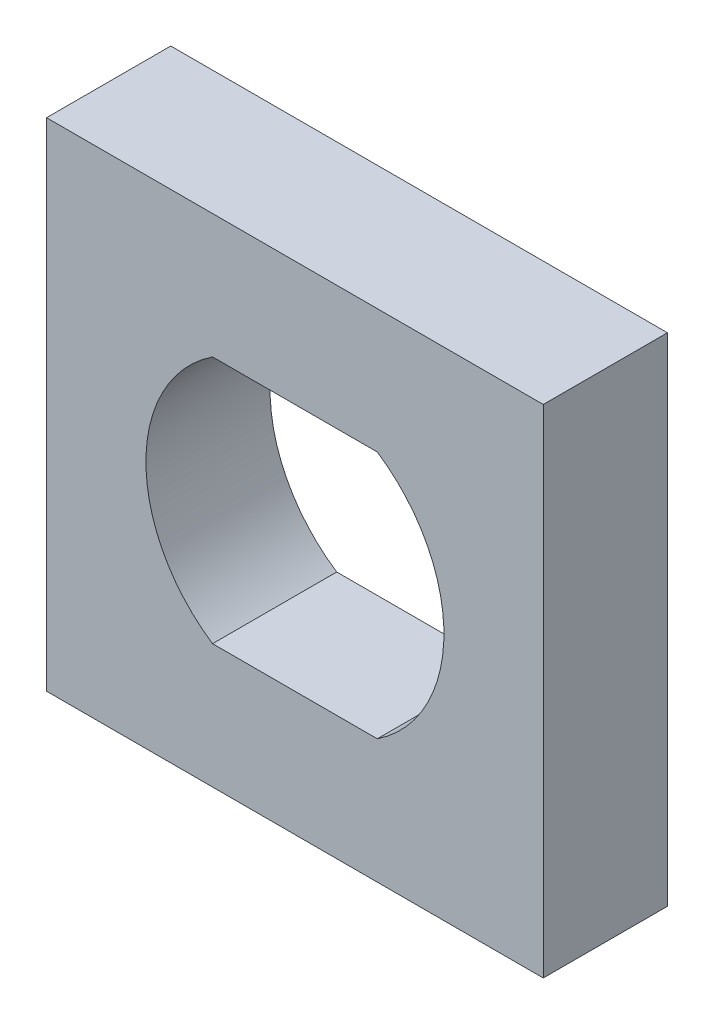
ISO-10303-21;
HEADER;
FILE_DESCRIPTION(('STEP AP214'),'2;1');
FILE_NAME('part.step','',(''),(''),'','','');
FILE_SCHEMA(('AUTOMOTIVE_DESIGN { 1 0 10303 214 1 1 1 1 }'));
ENDSEC;
DATA;
#1=APPLICATION_CONTEXT('core data for automotive mechanical design processes');
#2=APPLICATION_PROTOCOL_DEFINITION('international standard','automotive_design',2000,#1);
#3=PRODUCT_CONTEXT('',#1,'mechanical');
#4=PRODUCT('Part','Part','',(#3));
#5=PRODUCT_RELATED_PRODUCT_CATEGORY('part','',(#4));
#6=PRODUCT_DEFINITION_FORMATION('','',#4);
#7=PRODUCT_DEFINITION_CONTEXT('part definition',#1,'design');
#8=PRODUCT_DEFINITION('design','',#6,#7);
#9=PRODUCT_DEFINITION_SHAPE('','',#8);
#10=(LENGTH_UNIT() NAMED_UNIT(*) SI_UNIT(.MILLI.,.METRE.));
#11=(NAMED_UNIT(*) PLANE_ANGLE_UNIT() SI_UNIT($,.RADIAN.));
#12=(NAMED_UNIT(*) SI_UNIT($,.STERADIAN.) SOLID_ANGLE_UNIT());
#13=UNCERTAINTY_MEASURE_WITH_UNIT(LENGTH_MEASURE(1.E-05),#10,'distance_accuracy_value','');
#14=(GEOMETRIC_REPRESENTATION_CONTEXT(3) GLOBAL_UNCERTAINTY_ASSIGNED_CONTEXT((#13)) GLOBAL_UNIT_ASSIGNED_CONTEXT((#10,
#11,#12)) REPRESENTATION_CONTEXT('',''));
#15=CARTESIAN_POINT('',(0.,0.,0.));
#16=DIRECTION('',(0.,0.,1.));
#17=DIRECTION('',(1.,0.,0.));
#18=AXIS2_PLACEMENT_3D('',#15,#16,#17);
#19=CARTESIAN_POINT('',(10.,0.,5.));
#20=DIRECTION('',(1.,0.,0.));
#21=DIRECTION('',(0.,1.,0.));
#22=AXIS2_PLACEMENT_3D('',#19,#20,#21);
#23=PLANE('',#22);
#24=DIRECTION('',(0.,-1.,0.));
#25=VECTOR('',#24,1.);
#26=CARTESIAN_POINT('',(10.,0.,0.));
#27=LINE('',#26,#25);
#28=CARTESIAN_POINT('',(10.,9.99999999999999,0.));
#29=VERTEX_POINT('',#28);
#30=CARTESIAN_POINT('',(10.,-10.,0.));
#31=VERTEX_POINT('',#30);
#32=EDGE_CURVE('E143',#29,#31,#27,.T.);
#33=ORIENTED_EDGE('',*,*,#32,.F.);
#34=DIRECTION('',(0.,0.,-1.));
#35=VECTOR('',#34,1.);
#36=CARTESIAN_POINT('',(10.,9.99999999999999,5.));
#37=LINE('',#36,#35);
#38=CARTESIAN_POINT('',(10.,9.99999999999999,5.));
#39=VERTEX_POINT('',#38);
#40=EDGE_CURVE('E11',#39,#29,#37,.T.);
#41=ORIENTED_EDGE('',*,*,#40,.F.);
#42=DIRECTION('',(0.,-1.,0.));
#43=VECTOR('',#42,1.);
#44=CARTESIAN_POINT('',(10.,0.,5.));
#45=LINE('',#44,#43);
#46=CARTESIAN_POINT('',(10.,-10.,5.));
#47=VERTEX_POINT('',#46);
#48=EDGE_CURVE('E125',#39,#47,#45,.T.);
#49=ORIENTED_EDGE('',*,*,#48,.T.);
#50=DIRECTION('',(0.,0.,-1.));
#51=VECTOR('',#50,1.);
#52=CARTESIAN_POINT('',(10.,-10.,5.));
#53=LINE('',#52,#51);
#54=EDGE_CURVE('E87',#47,#31,#53,.T.);
#55=ORIENTED_EDGE('',*,*,#54,.T.);
#56=EDGE_LOOP('',(#33,#41,#49,#55));
#57=FACE_BOUND('',#56,.T.);
#58=ADVANCED_FACE('F33',(#57),#23,.T.);
#59=CARTESIAN_POINT('',(0.,9.99999999999999,5.));
#60=DIRECTION('',(0.,1.,0.));
#61=DIRECTION('',(0.,0.,1.));
#62=AXIS2_PLACEMENT_3D('',#59,#60,#61);
#63=PLANE('',#62);
#64=DIRECTION('',(1.,0.,0.));
#65=VECTOR('',#64,1.);
#66=CARTESIAN_POINT('',(0.,9.99999999999999,0.));
#67=LINE('',#66,#65);
#68=CARTESIAN_POINT('',(-10.,9.99999999999999,0.));
#69=VERTEX_POINT('',#68);
#70=EDGE_CURVE('E115',#69,#29,#67,.T.);
#71=ORIENTED_EDGE('',*,*,#70,.F.);
#72=DIRECTION('',(0.,0.,-1.));
#73=VECTOR('',#72,1.);
#74=CARTESIAN_POINT('',(-10.,9.99999999999999,5.));
#75=LINE('',#74,#73);
#76=CARTESIAN_POINT('',(-10.,9.99999999999999,5.));
#77=VERTEX_POINT('',#76);
#78=EDGE_CURVE('E43',#77,#69,#75,.T.);
#79=ORIENTED_EDGE('',*,*,#78,.F.);
#80=DIRECTION('',(1.,0.,0.));
#81=VECTOR('',#80,1.);
#82=CARTESIAN_POINT('',(0.,9.99999999999999,5.));
#83=LINE('',#82,#81);
#84=EDGE_CURVE('E113',#77,#39,#83,.T.);
#85=ORIENTED_EDGE('',*,*,#84,.T.);
#86=ORIENTED_EDGE('',*,*,#40,.T.);
#87=EDGE_LOOP('',(#71,#79,#85,#86));
#88=FACE_BOUND('',#87,.T.);
#89=ADVANCED_FACE('F111',(#88),#63,.T.);
#90=CARTESIAN_POINT('',(-10.,0.,5.));
#91=DIRECTION('',(1.,0.,0.));
#92=DIRECTION('',(0.,1.,0.));
#93=AXIS2_PLACEMENT_3D('',#90,#91,#92);
#94=PLANE('',#93);
#95=DIRECTION('',(0.,-1.,0.));
#96=VECTOR('',#95,1.);
#97=CARTESIAN_POINT('',(-10.,0.,0.));
#98=LINE('',#97,#96);
#99=CARTESIAN_POINT('',(-10.,-10.,0.));
#100=VERTEX_POINT('',#99);
#101=EDGE_CURVE('E146',#69,#100,#98,.T.);
#102=ORIENTED_EDGE('',*,*,#101,.T.);
#103=DIRECTION('',(0.,0.,-1.));
#104=VECTOR('',#103,1.);
#105=CARTESIAN_POINT('',(-10.,-10.,5.));
#106=LINE('',#105,#104);
#107=CARTESIAN_POINT('',(-10.,-10.,5.));
#108=VERTEX_POINT('',#107);
#109=EDGE_CURVE('E118',#108,#100,#106,.T.);
#110=ORIENTED_EDGE('',*,*,#109,.F.);
#111=DIRECTION('',(0.,-1.,0.));
#112=VECTOR('',#111,1.);
#113=CARTESIAN_POINT('',(-10.,0.,5.));
#114=LINE('',#113,#112);
#115=EDGE_CURVE('E121',#77,#108,#114,.T.);
#116=ORIENTED_EDGE('',*,*,#115,.F.);
#117=ORIENTED_EDGE('',*,*,#78,.T.);
#118=EDGE_LOOP('',(#102,#110,#116,#117));
#119=FACE_BOUND('',#118,.T.);
#120=ADVANCED_FACE('F122',(#119),#94,.F.);
#121=CARTESIAN_POINT('',(0.,0.,5.));
#122=DIRECTION('',(0.,0.,-1.));
#123=DIRECTION('',(-1.,0.,0.));
#124=AXIS2_PLACEMENT_3D('',#121,#122,#123);
#125=CYLINDRICAL_SURFACE('',#124,6.);
#126=CARTESIAN_POINT('',(0.,0.,0.));
#127=DIRECTION('',(0.,0.,1.));
#128=DIRECTION('',(1.,0.,0.));
#129=AXIS2_PLACEMENT_3D('',#126,#127,#128);
#130=CIRCLE('',#129,6.);
#131=CARTESIAN_POINT('',(3.3166247903554,-5.,0.));
#132=VERTEX_POINT('',#131);
#133=CARTESIAN_POINT('',(3.3166247903554,5.,0.));
#134=VERTEX_POINT('',#133);
#135=EDGE_CURVE('E133',#132,#134,#130,.T.);
#136=ORIENTED_EDGE('',*,*,#135,.F.);
#137=DIRECTION('',(0.,0.,-1.));
#138=VECTOR('',#137,1.);
#139=CARTESIAN_POINT('',(3.3166247903554,-5.,5.));
#140=LINE('',#139,#138);
#141=CARTESIAN_POINT('',(3.3166247903554,-5.,5.));
#142=VERTEX_POINT('',#141);
#143=EDGE_CURVE('E37',#142,#132,#140,.T.);
#144=ORIENTED_EDGE('',*,*,#143,.F.);
#145=CARTESIAN_POINT('',(0.,0.,5.));
#146=DIRECTION('',(0.,0.,1.));
#147=DIRECTION('',(1.,0.,0.));
#148=AXIS2_PLACEMENT_3D('',#145,#146,#147);
#149=CIRCLE('',#148,6.);
#150=CARTESIAN_POINT('',(3.3166247903554,5.,5.));
#151=VERTEX_POINT('',#150);
#152=EDGE_CURVE('E149',#142,#151,#149,.T.);
#153=ORIENTED_EDGE('',*,*,#152,.T.);
#154=DIRECTION('',(0.,0.,-1.));
#155=VECTOR('',#154,1.);
#156=CARTESIAN_POINT('',(3.3166247903554,5.,5.));
#157=LINE('',#156,#155);
#158=EDGE_CURVE('E132',#151,#134,#157,.T.);
#159=ORIENTED_EDGE('',*,*,#158,.T.);
#160=EDGE_LOOP('',(#136,#144,#153,#159));
#161=FACE_BOUND('',#160,.T.);
#162=ADVANCED_FACE('F164',(#161),#125,.F.);
#163=CARTESIAN_POINT('',(0.,-5.,5.));
#164=DIRECTION('',(0.,1.,0.));
#165=DIRECTION('',(0.,0.,1.));
#166=AXIS2_PLACEMENT_3D('',#163,#164,#165);
#167=PLANE('',#166);
#168=DIRECTION('',(1.,0.,0.));
#169=VECTOR('',#168,1.);
#170=CARTESIAN_POINT('',(0.,-5.,0.));
#171=LINE('',#170,#169);
#172=CARTESIAN_POINT('',(-3.3166247903554,-5.,0.));
#173=VERTEX_POINT('',#172);
#174=EDGE_CURVE('E136',#173,#132,#171,.T.);
#175=ORIENTED_EDGE('',*,*,#174,.F.);
#176=DIRECTION('',(0.,0.,-1.));
#177=VECTOR('',#176,1.);
#178=CARTESIAN_POINT('',(-3.3166247903554,-5.,5.));
#179=LINE('',#178,#177);
#180=CARTESIAN_POINT('',(-3.3166247903554,-5.,5.));
#181=VERTEX_POINT('',#180);
#182=EDGE_CURVE('E154',#181,#173,#179,.T.);
#183=ORIENTED_EDGE('',*,*,#182,.F.);
#184=DIRECTION('',(1.,0.,0.));
#185=VECTOR('',#184,1.);
#186=CARTESIAN_POINT('',(0.,-5.,5.));
#187=LINE('',#186,#185);
#188=EDGE_CURVE('E163',#181,#142,#187,.T.);
#189=ORIENTED_EDGE('',*,*,#188,.T.);
#190=ORIENTED_EDGE('',*,*,#143,.T.);
#191=EDGE_LOOP('',(#175,#183,#189,#190));
#192=FACE_BOUND('',#191,.T.);
#193=ADVANCED_FACE('F35',(#192),#167,.T.);
#194=CARTESIAN_POINT('',(-3.3166247903554,5.,0.));
#195=VERTEX_POINT('',#194);
#196=EDGE_CURVE('E137',#195,#173,#130,.T.);
#197=ORIENTED_EDGE('',*,*,#196,.F.);
#198=DIRECTION('',(0.,0.,-1.));
#199=VECTOR('',#198,1.);
#200=CARTESIAN_POINT('',(-3.3166247903554,5.,5.));
#201=LINE('',#200,#199);
#202=CARTESIAN_POINT('',(-3.3166247903554,5.,5.));
#203=VERTEX_POINT('',#202);
#204=EDGE_CURVE('E153',#203,#195,#201,.T.);
#205=ORIENTED_EDGE('',*,*,#204,.F.);
#206=EDGE_CURVE('E172',#203,#181,#149,.T.);
#207=ORIENTED_EDGE('',*,*,#206,.T.);
#208=ORIENTED_EDGE('',*,*,#182,.T.);
#209=EDGE_LOOP('',(#197,#205,#207,#208));
#210=FACE_BOUND('',#209,.T.);
#211=ADVANCED_FACE('F169',(#210),#125,.F.);
#212=CARTESIAN_POINT('',(0.,5.,5.));
#213=DIRECTION('',(0.,1.,0.));
#214=DIRECTION('',(-1.,0.,0.));
#215=AXIS2_PLACEMENT_3D('',#212,#213,#214);
#216=PLANE('',#215);
#217=DIRECTION('',(1.,0.,0.));
#218=VECTOR('',#217,1.);
#219=CARTESIAN_POINT('',(0.,5.,0.));
#220=LINE('',#219,#218);
#221=EDGE_CURVE('E140',#195,#134,#220,.T.);
#222=ORIENTED_EDGE('',*,*,#221,.T.);
#223=ORIENTED_EDGE('',*,*,#158,.F.);
#224=DIRECTION('',(1.,0.,0.));
#225=VECTOR('',#224,1.);
#226=CARTESIAN_POINT('',(0.,5.,5.));
#227=LINE('',#226,#225);
#228=EDGE_CURVE('E127',#203,#151,#227,.T.);
#229=ORIENTED_EDGE('',*,*,#228,.F.);
#230=ORIENTED_EDGE('',*,*,#204,.T.);
#231=EDGE_LOOP('',(#222,#223,#229,#230));
#232=FACE_BOUND('',#231,.T.);
#233=ADVANCED_FACE('F174',(#232),#216,.F.);
#234=CARTESIAN_POINT('',(0.,-10.,5.));
#235=DIRECTION('',(0.,1.,0.));
#236=DIRECTION('',(0.,0.,1.));
#237=AXIS2_PLACEMENT_3D('',#234,#235,#236);
#238=PLANE('',#237);
#239=DIRECTION('',(1.,0.,0.));
#240=VECTOR('',#239,1.);
#241=CARTESIAN_POINT('',(0.,-10.,0.));
#242=LINE('',#241,#240);
#243=EDGE_CURVE('E80',#100,#31,#242,.T.);
#244=ORIENTED_EDGE('',*,*,#243,.T.);
#245=ORIENTED_EDGE('',*,*,#54,.F.);
#246=DIRECTION('',(1.,0.,0.));
#247=VECTOR('',#246,1.);
#248=CARTESIAN_POINT('',(0.,-10.,5.));
#249=LINE('',#248,#247);
#250=EDGE_CURVE('E52',#108,#47,#249,.T.);
#251=ORIENTED_EDGE('',*,*,#250,.F.);
#252=ORIENTED_EDGE('',*,*,#109,.T.);
#253=EDGE_LOOP('',(#244,#245,#251,#252));
#254=FACE_BOUND('',#253,.T.);
#255=ADVANCED_FACE('F179',(#254),#238,.F.);
#256=CARTESIAN_POINT('',(0.,0.,5.));
#257=DIRECTION('',(0.,0.,1.));
#258=DIRECTION('',(1.,0.,0.));
#259=AXIS2_PLACEMENT_3D('',#256,#257,#258);
#260=PLANE('',#259);
#261=ORIENTED_EDGE('',*,*,#152,.F.);
#262=ORIENTED_EDGE('',*,*,#188,.F.);
#263=ORIENTED_EDGE('',*,*,#206,.F.);
#264=ORIENTED_EDGE('',*,*,#228,.T.);
#265=EDGE_LOOP('',(#261,#262,#263,#264));
#266=FACE_BOUND('',#265,.T.);
#267=ORIENTED_EDGE('',*,*,#48,.F.);
#268=ORIENTED_EDGE('',*,*,#84,.F.);
#269=ORIENTED_EDGE('',*,*,#115,.T.);
#270=ORIENTED_EDGE('',*,*,#250,.T.);
#271=EDGE_LOOP('',(#267,#268,#269,#270));
#272=FACE_BOUND('',#271,.T.);
#273=ADVANCED_FACE('F124',(#266,#272),#260,.T.);
#274=CARTESIAN_POINT('',(0.,0.,0.));
#275=DIRECTION('',(0.,0.,1.));
#276=DIRECTION('',(1.,0.,0.));
#277=AXIS2_PLACEMENT_3D('',#274,#275,#276);
#278=PLANE('',#277);
#279=ORIENTED_EDGE('',*,*,#135,.T.);
#280=ORIENTED_EDGE('',*,*,#221,.F.);
#281=ORIENTED_EDGE('',*,*,#196,.T.);
#282=ORIENTED_EDGE('',*,*,#174,.T.);
#283=EDGE_LOOP('',(#279,#280,#281,#282));
#284=FACE_BOUND('',#283,.T.);
#285=ORIENTED_EDGE('',*,*,#32,.T.);
#286=ORIENTED_EDGE('',*,*,#243,.F.);
#287=ORIENTED_EDGE('',*,*,#101,.F.);
#288=ORIENTED_EDGE('',*,*,#70,.T.);
#289=EDGE_LOOP('',(#285,#286,#287,#288));
#290=FACE_BOUND('',#289,.T.);
#291=ADVANCED_FACE('F168',(#284,#290),#278,.F.);
#292=CLOSED_SHELL('',(#58,#89,#120,#162,#193,#211,#233,#255,#273,#291));
#293=MANIFOLD_SOLID_BREP('B2',#292);
#294=ADVANCED_BREP_SHAPE_REPRESENTATION('',(#18,#293),#14);
#295=SHAPE_DEFINITION_REPRESENTATION(#9,#294);
ENDSEC;
END-ISO-10303-21;
